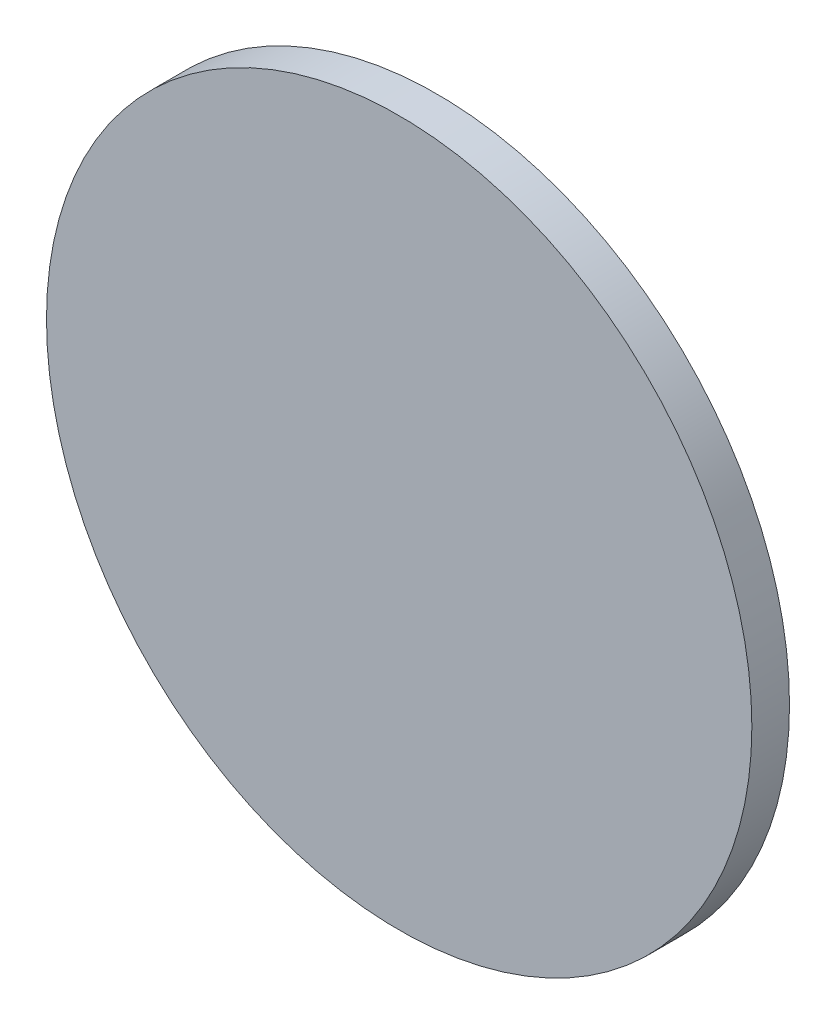
ISO-10303-21;
HEADER;
FILE_DESCRIPTION(('STEP AP214'),'2;1');
FILE_NAME('part.step','',(''),(''),'','','');
FILE_SCHEMA(('AUTOMOTIVE_DESIGN { 1 0 10303 214 1 1 1 1 }'));
ENDSEC;
DATA;
#1=APPLICATION_CONTEXT('core data for automotive mechanical design processes');
#2=APPLICATION_PROTOCOL_DEFINITION('international standard','automotive_design',2000,#1);
#3=PRODUCT_CONTEXT('',#1,'mechanical');
#4=PRODUCT('Part','Part','',(#3));
#5=PRODUCT_RELATED_PRODUCT_CATEGORY('part','',(#4));
#6=PRODUCT_DEFINITION_FORMATION('','',#4);
#7=PRODUCT_DEFINITION_CONTEXT('part definition',#1,'design');
#8=PRODUCT_DEFINITION('design','',#6,#7);
#9=PRODUCT_DEFINITION_SHAPE('','',#8);
#10=(LENGTH_UNIT() NAMED_UNIT(*) SI_UNIT(.MILLI.,.METRE.));
#11=(NAMED_UNIT(*) PLANE_ANGLE_UNIT() SI_UNIT($,.RADIAN.));
#12=(NAMED_UNIT(*) SI_UNIT($,.STERADIAN.) SOLID_ANGLE_UNIT());
#13=UNCERTAINTY_MEASURE_WITH_UNIT(LENGTH_MEASURE(1.E-05),#10,'distance_accuracy_value','');
#14=(GEOMETRIC_REPRESENTATION_CONTEXT(3) GLOBAL_UNCERTAINTY_ASSIGNED_CONTEXT((#13)) GLOBAL_UNIT_ASSIGNED_CONTEXT((#10,
#11,#12)) REPRESENTATION_CONTEXT('',''));
#15=CARTESIAN_POINT('',(0.,0.,0.));
#16=DIRECTION('',(0.,0.,1.));
#17=DIRECTION('',(1.,0.,0.));
#18=AXIS2_PLACEMENT_3D('',#15,#16,#17);
#19=CARTESIAN_POINT('',(0.,0.,1.58));
#20=DIRECTION('',(0.,0.,-1.));
#21=DIRECTION('',(-1.,0.,0.));
#22=AXIS2_PLACEMENT_3D('',#19,#20,#21);
#23=CYLINDRICAL_SURFACE('',#22,14.8);
#24=CARTESIAN_POINT('',(0.,0.,1.58));
#25=DIRECTION('',(0.,0.,1.));
#26=DIRECTION('',(1.,0.,0.));
#27=AXIS2_PLACEMENT_3D('',#24,#25,#26);
#28=CIRCLE('',#27,14.8);
#29=CARTESIAN_POINT('',(-14.8,0.,1.58));
#30=VERTEX_POINT('',#29);
#31=EDGE_CURVE('E10',#30,#30,#28,.T.);
#32=CARTESIAN_POINT('',(0.,0.,0.));
#33=DIRECTION('',(0.,0.,1.));
#34=DIRECTION('',(1.,0.,0.));
#35=AXIS2_PLACEMENT_3D('',#32,#33,#34);
#36=CIRCLE('',#35,14.8);
#37=CARTESIAN_POINT('',(-14.8,0.,0.));
#38=VERTEX_POINT('',#37);
#39=EDGE_CURVE('E34',#38,#38,#36,.T.);
#40=CARTESIAN_POINT('',(-14.8,0.,1.58));
#41=CARTESIAN_POINT('',(-14.8,0.,1.56354166666667));
#42=CARTESIAN_POINT('',(-14.8,0.,1.54708333333333));
#43=CARTESIAN_POINT('',(-14.8,0.,1.51416666666667));
#44=CARTESIAN_POINT('',(-14.8,0.,1.49770833333333));
#45=CARTESIAN_POINT('',(-14.8,0.,1.46479166666667));
#46=CARTESIAN_POINT('',(-14.8,0.,1.44833333333333));
#47=CARTESIAN_POINT('',(-14.8,0.,1.41541666666667));
#48=CARTESIAN_POINT('',(-14.8,0.,1.39895833333333));
#49=CARTESIAN_POINT('',(-14.8,0.,1.36604166666667));
#50=CARTESIAN_POINT('',(-14.8,0.,1.34958333333333));
#51=CARTESIAN_POINT('',(-14.8,0.,1.31666666666667));
#52=CARTESIAN_POINT('',(-14.8,0.,1.30020833333333));
#53=CARTESIAN_POINT('',(-14.8,0.,1.26729166666667));
#54=CARTESIAN_POINT('',(-14.8,0.,1.25083333333333));
#55=CARTESIAN_POINT('',(-14.8,0.,1.21791666666667));
#56=CARTESIAN_POINT('',(-14.8,0.,1.20145833333333));
#57=CARTESIAN_POINT('',(-14.8,0.,1.16854166666667));
#58=CARTESIAN_POINT('',(-14.8,0.,1.15208333333333));
#59=CARTESIAN_POINT('',(-14.8,0.,1.11916666666667));
#60=CARTESIAN_POINT('',(-14.8,0.,1.10270833333333));
#61=CARTESIAN_POINT('',(-14.8,0.,1.06979166666667));
#62=CARTESIAN_POINT('',(-14.8,0.,1.05333333333333));
#63=CARTESIAN_POINT('',(-14.8,0.,1.02041666666667));
#64=CARTESIAN_POINT('',(-14.8,0.,1.00395833333333));
#65=CARTESIAN_POINT('',(-14.8,0.,0.971041666666667));
#66=CARTESIAN_POINT('',(-14.8,0.,0.954583333333333));
#67=CARTESIAN_POINT('',(-14.8,0.,0.921666666666667));
#68=CARTESIAN_POINT('',(-14.8,0.,0.905208333333333));
#69=CARTESIAN_POINT('',(-14.8,0.,0.872291666666667));
#70=CARTESIAN_POINT('',(-14.8,0.,0.855833333333333));
#71=CARTESIAN_POINT('',(-14.8,0.,0.822916666666667));
#72=CARTESIAN_POINT('',(-14.8,0.,0.806458333333333));
#73=CARTESIAN_POINT('',(-14.8,0.,0.773541666666667));
#74=CARTESIAN_POINT('',(-14.8,0.,0.757083333333333));
#75=CARTESIAN_POINT('',(-14.8,0.,0.724166666666667));
#76=CARTESIAN_POINT('',(-14.8,0.,0.707708333333333));
#77=CARTESIAN_POINT('',(-14.8,0.,0.674791666666667));
#78=CARTESIAN_POINT('',(-14.8,0.,0.658333333333333));
#79=CARTESIAN_POINT('',(-14.8,0.,0.625416666666667));
#80=CARTESIAN_POINT('',(-14.8,0.,0.608958333333333));
#81=CARTESIAN_POINT('',(-14.8,0.,0.576041666666667));
#82=CARTESIAN_POINT('',(-14.8,0.,0.559583333333333));
#83=CARTESIAN_POINT('',(-14.8,0.,0.526666666666667));
#84=CARTESIAN_POINT('',(-14.8,0.,0.510208333333333));
#85=CARTESIAN_POINT('',(-14.8,0.,0.477291666666667));
#86=CARTESIAN_POINT('',(-14.8,0.,0.460833333333333));
#87=CARTESIAN_POINT('',(-14.8,0.,0.427916666666667));
#88=CARTESIAN_POINT('',(-14.8,0.,0.411458333333333));
#89=CARTESIAN_POINT('',(-14.8,0.,0.378541666666667));
#90=CARTESIAN_POINT('',(-14.8,0.,0.362083333333333));
#91=CARTESIAN_POINT('',(-14.8,0.,0.329166666666667));
#92=CARTESIAN_POINT('',(-14.8,0.,0.312708333333333));
#93=CARTESIAN_POINT('',(-14.8,0.,0.279791666666667));
#94=CARTESIAN_POINT('',(-14.8,0.,0.263333333333333));
#95=CARTESIAN_POINT('',(-14.8,0.,0.230416666666667));
#96=CARTESIAN_POINT('',(-14.8,0.,0.213958333333333));
#97=CARTESIAN_POINT('',(-14.8,0.,0.181041666666667));
#98=CARTESIAN_POINT('',(-14.8,0.,0.164583333333333));
#99=CARTESIAN_POINT('',(-14.8,0.,0.131666666666667));
#100=CARTESIAN_POINT('',(-14.8,0.,0.115208333333333));
#101=CARTESIAN_POINT('',(-14.8,0.,0.0822916666666667));
#102=CARTESIAN_POINT('',(-14.8,0.,0.0658333333333333));
#103=CARTESIAN_POINT('',(-14.8,0.,0.0329166666666666));
#104=CARTESIAN_POINT('',(-14.8,0.,0.0164583333333333));
#105=CARTESIAN_POINT('',(-14.8,0.,0.));
#106=B_SPLINE_CURVE_WITH_KNOTS('',3,(#40,#41,#42,#43,#44,#45,#46,#47,#48,#49,#50,#51,#52,#53,
#54,#55,#56,#57,#58,#59,#60,#61,#62,#63,#64,#65,#66,#67,#68,#69,#70,#71,#72,#73,#74,#75,#76,#77,
#78,#79,#80,#81,#82,#83,#84,#85,#86,#87,#88,#89,#90,#91,#92,#93,#94,#95,#96,#97,#98,#99,#100,
#101,#102,#103,#104,#105),.UNSPECIFIED.,.F.,.F.,(4,2,2,2,2,2,2,2,2,2,2,2,2,2,2,2,2,2,2,2,2,2,2,
2,2,2,2,2,2,2,2,2,4),(0.,0.0493749999999999,0.0987499999999999,0.148125,0.1975,0.246875,0.29625,
0.345625,0.395,0.444375,0.49375,0.543125,0.5925,0.641875,0.69125,0.740625,0.79,0.839375,0.88875,
0.938125,0.9875,1.036875,1.08625,1.135625,1.185,1.234375,1.28375,1.333125,1.3825,1.431875,
1.48125,1.530625,1.58),.UNSPECIFIED.);
#107=EDGE_CURVE('BSEAM31',#30,#38,#106,.T.);
#108=ORIENTED_EDGE('',*,*,#31,.F.);
#109=ORIENTED_EDGE('',*,*,#39,.T.);
#110=ORIENTED_EDGE('',*,*,#107,.T.);
#111=ORIENTED_EDGE('',*,*,#107,.F.);
#112=EDGE_LOOP('',(#108,#110,#109,#111));
#113=FACE_BOUND('',#112,.T.);
#114=ADVANCED_FACE('F31',(#113),#23,.T.);
#115=CARTESIAN_POINT('',(0.,0.,1.58));
#116=DIRECTION('',(0.,0.,1.));
#117=DIRECTION('',(1.,0.,0.));
#118=AXIS2_PLACEMENT_3D('',#115,#116,#117);
#119=PLANE('',#118);
#120=ORIENTED_EDGE('',*,*,#31,.T.);
#121=EDGE_LOOP('',(#120));
#122=FACE_BOUND('',#121,.T.);
#123=ADVANCED_FACE('F46',(#122),#119,.T.);
#124=CARTESIAN_POINT('',(0.,0.,0.));
#125=DIRECTION('',(0.,0.,1.));
#126=DIRECTION('',(1.,0.,0.));
#127=AXIS2_PLACEMENT_3D('',#124,#125,#126);
#128=PLANE('',#127);
#129=ORIENTED_EDGE('',*,*,#39,.F.);
#130=EDGE_LOOP('',(#129));
#131=FACE_BOUND('',#130,.T.);
#132=ADVANCED_FACE('F44',(#131),#128,.F.);
#133=CLOSED_SHELL('',(#114,#123,#132));
#134=MANIFOLD_SOLID_BREP('B2',#133);
#135=ADVANCED_BREP_SHAPE_REPRESENTATION('',(#18,#134),#14);
#136=SHAPE_DEFINITION_REPRESENTATION(#9,#135);
ENDSEC;
END-ISO-10303-21;
